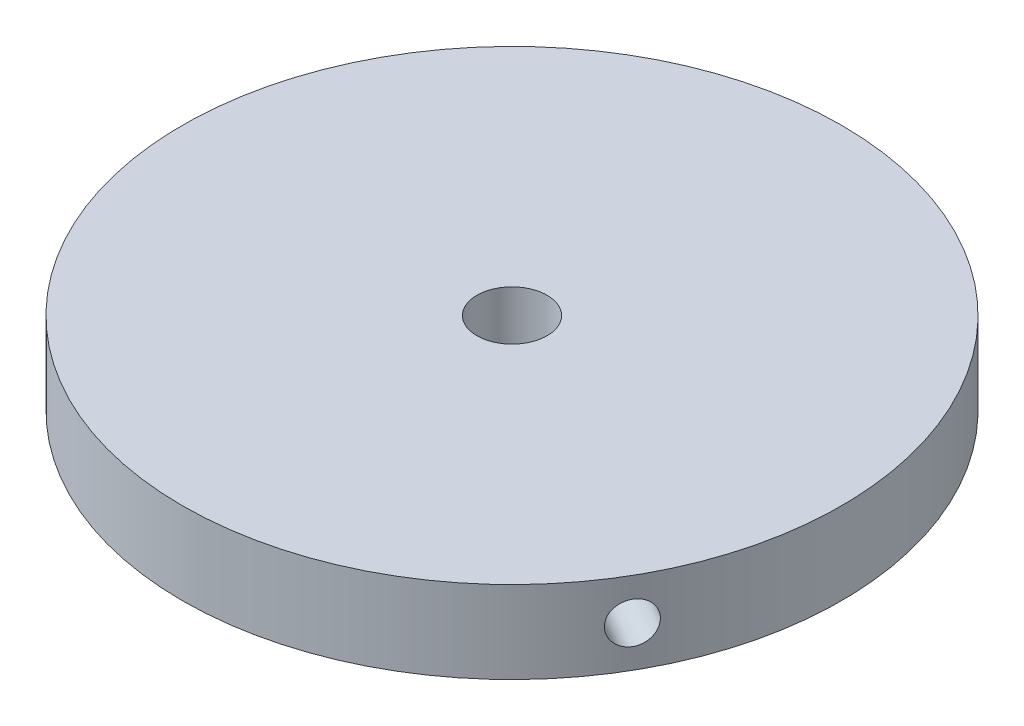
ISO-10303-21;
HEADER;
FILE_DESCRIPTION(('STEP AP214'),'2;1');
FILE_NAME('part.step','',(''),(''),'','','');
FILE_SCHEMA(('AUTOMOTIVE_DESIGN { 1 0 10303 214 1 1 1 1 }'));
ENDSEC;
DATA;
#1=APPLICATION_CONTEXT('core data for automotive mechanical design processes');
#2=APPLICATION_PROTOCOL_DEFINITION('international standard','automotive_design',2000,#1);
#3=PRODUCT_CONTEXT('',#1,'mechanical');
#4=PRODUCT('Part','Part','',(#3));
#5=PRODUCT_RELATED_PRODUCT_CATEGORY('part','',(#4));
#6=PRODUCT_DEFINITION_FORMATION('','',#4);
#7=PRODUCT_DEFINITION_CONTEXT('part definition',#1,'design');
#8=PRODUCT_DEFINITION('design','',#6,#7);
#9=PRODUCT_DEFINITION_SHAPE('','',#8);
#10=(LENGTH_UNIT() NAMED_UNIT(*) SI_UNIT(.MILLI.,.METRE.));
#11=(NAMED_UNIT(*) PLANE_ANGLE_UNIT() SI_UNIT($,.RADIAN.));
#12=(NAMED_UNIT(*) SI_UNIT($,.STERADIAN.) SOLID_ANGLE_UNIT());
#13=UNCERTAINTY_MEASURE_WITH_UNIT(LENGTH_MEASURE(1.E-05),#10,'distance_accuracy_value','');
#14=(GEOMETRIC_REPRESENTATION_CONTEXT(3) GLOBAL_UNCERTAINTY_ASSIGNED_CONTEXT((#13)) GLOBAL_UNIT_ASSIGNED_CONTEXT((#10,
#11,#12)) REPRESENTATION_CONTEXT('',''));
#15=CARTESIAN_POINT('',(0.,0.,0.));
#16=DIRECTION('',(0.,0.,1.));
#17=DIRECTION('',(1.,0.,0.));
#18=AXIS2_PLACEMENT_3D('',#15,#16,#17);
#19=CARTESIAN_POINT('',(0.,9.525,0.));
#20=DIRECTION('',(0.,-1.,0.));
#21=DIRECTION('',(0.,0.,-1.));
#22=AXIS2_PLACEMENT_3D('',#19,#20,#21);
#23=CYLINDRICAL_SURFACE('',#22,38.1508);
#24=CARTESIAN_POINT('',(-2.37489999999947,4.7625,-38.0768090920182));
#25=CARTESIAN_POINT('',(-2.37489413586988,4.62923955778668,-38.0768100819438));
#26=CARTESIAN_POINT('',(-2.3636460392407,4.49588577984348,-38.0775161883294));
#27=CARTESIAN_POINT('',(-2.31893657361351,4.232860377529,-38.0802646535466));
#28=CARTESIAN_POINT('',(-2.28544934224252,4.10319322370958,-38.0823085681043));
#29=CARTESIAN_POINT('',(-2.19722713386213,3.85138910460707,-38.0875002420933));
#30=CARTESIAN_POINT('',(-2.14250336402618,3.72924820681886,-38.0906474192143));
#31=CARTESIAN_POINT('',(-2.0133795940541,3.49591769520562,-38.0976902671423));
#32=CARTESIAN_POINT('',(-1.93898410247743,3.38472558003412,-38.1015857663855));
#33=CARTESIAN_POINT('',(-1.77250693563962,3.176251083003,-38.1096929054201));
#34=CARTESIAN_POINT('',(-1.68040211679666,3.0789871968151,-38.1139049544608));
#35=CARTESIAN_POINT('',(-1.48116851449491,2.90128838746387,-38.1221667814194));
#36=CARTESIAN_POINT('',(-1.37403910499128,2.8208541659074,-38.1262165525666));
#37=CARTESIAN_POINT('',(-1.14769361589969,2.67904159506788,-38.1337010098159));
#38=CARTESIAN_POINT('',(-1.02846798471381,2.61767846278846,-38.1371352038233));
#39=CARTESIAN_POINT('',(-0.781381432869679,2.5158473968257,-38.1429972531246));
#40=CARTESIAN_POINT('',(-0.653520604057076,2.47537924093886,-38.1454251191201));
#41=CARTESIAN_POINT('',(-0.392970572386161,2.41653795295291,-38.14899812944));
#42=CARTESIAN_POINT('',(-0.260287906823042,2.39813597689565,-38.1501449481596));
#43=CARTESIAN_POINT('',(0.00628768139456512,2.38386034131269,-38.1510322802792));
#44=CARTESIAN_POINT('',(0.140180590481936,2.38798642955395,-38.1507728094246));
#45=CARTESIAN_POINT('',(0.40518056389998,2.41862599791999,-38.1488781975727));
#46=CARTESIAN_POINT('',(0.536291231372274,2.44510844890602,-38.1472449632788));
#47=CARTESIAN_POINT('',(0.792202661450943,2.51966085334001,-38.1427888978946));
#48=CARTESIAN_POINT('',(0.917003386990177,2.567730933586,-38.1399660598169));
#49=CARTESIAN_POINT('',(1.15685190218015,2.68412920345676,-38.1334453417321));
#50=CARTESIAN_POINT('',(1.27189284970607,2.75247145647459,-38.1297468546225));
#51=CARTESIAN_POINT('',(1.48888149212011,2.90746385150151,-38.1218910792771));
#52=CARTESIAN_POINT('',(1.59082904086178,2.99411419783409,-38.117733785921));
#53=CARTESIAN_POINT('',(1.77891807211025,3.18343834404288,-38.1094199524432));
#54=CARTESIAN_POINT('',(1.86503244858678,3.28613907600321,-38.1052634255623));
#55=CARTESIAN_POINT('',(2.01880167507915,3.50455433185018,-38.0974267833623));
#56=CARTESIAN_POINT('',(2.0864565178113,3.62026886087174,-38.0937466682312));
#57=CARTESIAN_POINT('',(2.20138426186296,3.86144420670882,-38.0872784233891));
#58=CARTESIAN_POINT('',(2.2486560241653,3.98690556772019,-38.0844903435277));
#59=CARTESIAN_POINT('',(2.32145703284981,4.24400529851785,-38.0801223662641));
#60=CARTESIAN_POINT('',(2.34698653295725,4.37564359620235,-38.078542454763));
#61=CARTESIAN_POINT('',(2.37554456262128,4.64112403462579,-38.0767716250642));
#62=CARTESIAN_POINT('',(2.37861076964001,4.77496210752388,-38.076578381034));
#63=CARTESIAN_POINT('',(2.36225361437069,5.04125075694188,-38.0775966028876));
#64=CARTESIAN_POINT('',(2.34283036815736,5.17370134061948,-38.0788080615213));
#65=CARTESIAN_POINT('',(2.28207695841431,5.43334869114237,-38.0824970401971));
#66=CARTESIAN_POINT('',(2.24076414495978,5.56054953308105,-38.0849735574747));
#67=CARTESIAN_POINT('',(2.13742189487269,5.80621240610458,-38.0909127162222));
#68=CARTESIAN_POINT('',(2.07539227186152,5.92467435855839,-38.0943753665638));
#69=CARTESIAN_POINT('',(1.93228090698796,6.14966982436562,-38.1019022210508));
#70=CARTESIAN_POINT('',(1.85117391791104,6.25618725192498,-38.1059672196904));
#71=CARTESIAN_POINT('',(1.67224690008343,6.45410799017376,-38.114237898853));
#72=CARTESIAN_POINT('',(1.57442670893768,6.54551115398734,-38.1184435807428));
#73=CARTESIAN_POINT('',(1.36468789444997,6.71073601297687,-38.1265285018216));
#74=CARTESIAN_POINT('',(1.25275004490358,6.784533327553,-38.1304072835698));
#75=CARTESIAN_POINT('',(1.01805012157128,6.91228481852507,-38.1373947640191));
#76=CARTESIAN_POINT('',(0.895288114121894,6.9662391165197,-38.1405034674392));
#77=CARTESIAN_POINT('',(0.642514294357509,7.05273059877783,-38.1455983227291));
#78=CARTESIAN_POINT('',(0.512507780119615,7.08528321727929,-38.1475852834189));
#79=CARTESIAN_POINT('',(0.248861678355636,7.12809780261563,-38.1502159896755));
#80=CARTESIAN_POINT('',(0.11522212624859,7.13835998668448,-38.1508597483325));
#81=CARTESIAN_POINT('',(-0.151655169187097,7.13630028784523,-38.1507315538222));
#82=CARTESIAN_POINT('',(-0.284893209839764,7.12401656293667,-38.1499619926377));
#83=CARTESIAN_POINT('',(-0.547411038605765,7.077292844921,-38.147098450074));
#84=CARTESIAN_POINT('',(-0.676690819747182,7.04285281279105,-38.1450044663621));
#85=CARTESIAN_POINT('',(-0.927628163273493,6.95280269179797,-38.1397274474392));
#86=CARTESIAN_POINT('',(-1.04928577692349,6.89719274533709,-38.1365444195538));
#87=CARTESIAN_POINT('',(-1.28154243610964,6.76638670676156,-38.1294467063049));
#88=CARTESIAN_POINT('',(-1.39214176954909,6.69119112474452,-38.1255320399973));
#89=CARTESIAN_POINT('',(-1.59933578468099,6.52320748874398,-38.1174035323818));
#90=CARTESIAN_POINT('',(-1.69590811058063,6.4303918839951,-38.1131892291022));
#91=CARTESIAN_POINT('',(-1.87213418981856,6.22983923703435,-38.1049400887678));
#92=CARTESIAN_POINT('',(-1.95178379632911,6.12209854816575,-38.1009052958922));
#93=CARTESIAN_POINT('',(-2.09196199764921,5.89463178225065,-38.0934664290719));
#94=CARTESIAN_POINT('',(-2.15246685818654,5.77489106858609,-38.090063140164));
#95=CARTESIAN_POINT('',(-2.25243945975448,5.52701648102729,-38.0842826921491));
#96=CARTESIAN_POINT('',(-2.29193184490374,5.39889263816541,-38.0819043315978));
#97=CARTESIAN_POINT('',(-2.33849192023782,5.18540389169755,-38.0790664594053));
#98=CARTESIAN_POINT('',(-2.35212729985988,5.10141904615949,-38.0782237283132));
#99=CARTESIAN_POINT('',(-2.37033320377627,4.93246879176428,-38.0770947292796));
#100=CARTESIAN_POINT('',(-2.37490374057584,4.84750338426001,-38.0768084605703));
#101=CARTESIAN_POINT('',(-2.37489999999947,4.7625,-38.0768090920182));
#102=B_SPLINE_CURVE_WITH_KNOTS('',3,(#24,#25,#26,#27,#28,#29,#30,#31,#32,#33,#34,#35,#36,#37,
#38,#39,#40,#41,#42,#43,#44,#45,#46,#47,#48,#49,#50,#51,#52,#53,#54,#55,#56,#57,#58,#59,#60,#61,
#62,#63,#64,#65,#66,#67,#68,#69,#70,#71,#72,#73,#74,#75,#76,#77,#78,#79,#80,#81,#82,#83,#84,#85,
#86,#87,#88,#89,#90,#91,#92,#93,#94,#95,#96,#97,#98,#99,#100,#101),.UNSPECIFIED.,.T.,.F.,(4,2,2,
2,2,2,2,2,2,2,2,2,2,2,2,2,2,2,2,2,2,2,2,2,2,2,2,2,2,2,2,2,2,2,2,2,2,2,4),(0.,0.399471011661398,
0.799407392231101,1.19913300048188,1.59876707495754,1.99892700861405,2.39910362109611,
2.7995987233652,3.20008956656062,3.60005633273725,4.00001862073843,4.39942669872803,
4.79883712272907,5.19852527991674,5.59821789797274,5.99858853572004,6.39895933144387,
6.79935249719801,7.19974099042739,7.59945776186392,7.99917247025311,8.39857083028703,
8.79797278360191,9.19790631413617,9.59784373087501,9.99833180773223,10.3988174303438,
10.7990139172115,11.199206503901,11.5987224059799,11.9982390117092,12.3977529300847,
12.7972564443702,13.1973898477847,13.5976211890897,13.9983467816923,14.3986013483959,
14.6534139108114,14.9082261217046),.UNSPECIFIED.);
#103=CARTESIAN_POINT('',(-2.37489999999947,4.7625,-38.0768090920182));
#104=VERTEX_POINT('',#103);
#105=EDGE_CURVE('E64',#104,#104,#102,.T.);
#106=ORIENTED_EDGE('',*,*,#105,.T.);
#107=EDGE_LOOP('',(#106));
#108=FACE_BOUND('',#107,.T.);
#109=CARTESIAN_POINT('',(34.1629339687377,4.7625,16.9816808145621));
#110=CARTESIAN_POINT('',(34.1629318939736,4.62923955778668,16.9816863880101));
#111=CARTESIAN_POINT('',(34.1579193517268,4.49588577984348,16.9917805786279));
#112=CARTESIAN_POINT('',(34.1379448596126,4.232860377529,17.0318743442593));
#113=CARTESIAN_POINT('',(34.1229713258573,4.10319322370958,17.0618970946079));
#114=CARTESIAN_POINT('',(34.0833563432297,3.85138910460707,17.1408956052377));
#115=CARTESIAN_POINT('',(34.0587199936488,3.72924820681886,17.189861368667));
#116=CARTESIAN_POINT('',(34.0002573938834,3.49591769520562,17.3052072576593));
#117=CARTESIAN_POINT('',(33.9664332494,3.38472558003412,17.3715833929133));
#118=CARTESIAN_POINT('',(33.8902156543372,3.176251083003,17.5198104180622));
#119=CARTESIAN_POINT('',(33.8478109863869,3.0789871968151,17.6016815555115));
#120=CARTESIAN_POINT('',(33.7553491372638,2.90128838746387,17.7783538298716));
#121=CARTESIAN_POINT('',(33.705291637205,2.8208541659074,17.8731555055678));
#122=CARTESIAN_POINT('',(33.5986006227706,2.67904159506788,18.0729186777778));
#123=CARTESIAN_POINT('',(33.5419619064296,2.61767846278846,18.1778882001707));
#124=CARTESIAN_POINT('',(33.4234953141207,2.5158473968257,18.3948024556518));
#125=CARTESIAN_POINT('',(33.3616674933435,2.47537924093885,18.5067471145502));
#126=CARTESIAN_POINT('',(33.2344867952131,2.41653795295291,18.734176566094));
#127=CARTESIAN_POINT('',(33.1691386365762,2.39813597689565,18.8496565344733));
#128=CARTESIAN_POINT('',(33.0366192946246,2.38386034131269,19.0809614319583));
#129=CARTESIAN_POINT('',(32.9694481317292,2.38798642955395,19.1967863571873));
#130=CARTESIAN_POINT('',(32.8353073630262,2.41862599791998,19.4253357602436));
#131=CARTESIAN_POINT('',(32.7683376069012,2.44510844890602,19.5380643118348));
#132=CARTESIAN_POINT('',(32.6365228260382,2.51966085334001,19.7574620787096));
#133=CARTESIAN_POINT('',(32.5716778137826,2.567730933586,19.8641312583985));
#134=CARTESIAN_POINT('',(32.4461064486752,2.68412920345676,20.0685858065706));
#135=CARTESIAN_POINT('',(32.3853829911198,2.7524714564746,20.1663649460487));
#136=CARTESIAN_POINT('',(32.2700853688972,2.90746385150152,20.3503547350392));
#137=CARTESIAN_POINT('',(32.215511272869,2.99411419783409,20.436565255425));
#138=CARTESIAN_POINT('',(32.1142667662502,3.18343834404288,20.5952982179205));
#139=CARTESIAN_POINT('',(32.0676099201415,3.28613907600321,20.6677971921397));
#140=CARTESIAN_POINT('',(31.9839385756697,3.50455433185018,20.7970469275024));
#141=CARTESIAN_POINT('',(31.9469240811113,3.62026886087174,20.8537976824319));
#142=CARTESIAN_POINT('',(31.8838585447343,3.86144420670882,20.9500939059593));
#143=CARTESIAN_POINT('',(31.8578081155954,3.9869055677202,20.9896384130641));
#144=CARTESIAN_POINT('',(31.8176248319797,4.24400529851786,21.0505019473742));
#145=CARTESIAN_POINT('',(31.8034918384303,4.37564359620235,21.0718211872626));
#146=CARTESIAN_POINT('',(31.7876792400934,4.64112403462579,21.0956677515843));
#147=CARTESIAN_POINT('',(31.7859787823447,4.77496210752388,21.0982265427407));
#148=CARTESIAN_POINT('',(31.7950391659712,5.04125075694188,21.0845699416706));
#149=CARTESIAN_POINT('',(31.8057999430303,5.17370134061948,21.0683546463427));
#150=CARTESIAN_POINT('',(31.8393713971491,5.43334869114237,21.0175851394766));
#151=CARTESIAN_POINT('',(31.8621725307517,5.56054953308105,20.983045452162));
#152=CARTESIAN_POINT('',(31.9189871181477,5.80621240610458,20.8965180176761));
#153=CARTESIAN_POINT('',(31.9530006728135,5.92467435855839,20.844530113532));
#154=CARTESIAN_POINT('',(32.0310748024467,6.14966982436562,20.7243554632248));
#155=CARTESIAN_POINT('',(32.0751486890733,6.25618725192498,20.6561472495795));
#156=CARTESIAN_POINT('',(32.1717748162486,6.45410799017376,20.5053272462987));
#157=CARTESIAN_POINT('',(32.2243271391782,6.54551115398734,20.4227153167083));
#158=CARTESIAN_POINT('',(32.3361982934638,6.71073601297687,20.2451186357417));
#159=CARTESIAN_POINT('',(32.3955263417667,6.784533327553,20.1501170052636));
#160=CARTESIAN_POINT('',(32.5189276390104,6.91228481852506,19.9503546496163));
#161=CARTESIAN_POINT('',(32.5830008588698,6.9662391165197,19.8455939842556));
#162=CARTESIAN_POINT('',(32.7138000428616,7.05273059877783,19.6292328625729));
#163=CARTESIAN_POINT('',(32.7805240584143,7.08528321727929,19.5176373989304));
#164=CARTESIAN_POINT('',(32.9146253677443,7.12809780261563,19.2906285303223));
#165=CARTESIAN_POINT('',(32.9820026551487,7.13835998668448,19.1752151625757));
#166=CARTESIAN_POINT('',(33.115330283164,7.13630028784523,18.94402854778));
#167=CARTESIAN_POINT('',(33.1812828439548,7.12401656293667,18.8282562392321));
#168=CARTESIAN_POINT('',(33.3100618577329,7.077292844921,18.5994773592925));
#169=CARTESIAN_POINT('',(33.372888305214,7.04285281279105,18.4864707927724));
#170=CARTESIAN_POINT('',(33.4937869445336,6.95280269179797,18.266514169059));
#171=CARTESIAN_POINT('',(33.5518591683489,6.89719274533708,18.1595640711316));
#172=CARTESIAN_POINT('',(33.6618406979597,6.76638670676156,17.9548750474539));
#173=CARTESIAN_POINT('',(33.7137501642097,6.69119112474452,17.8571358818999));
#174=CARTESIAN_POINT('',(33.8103076776858,6.52320748874398,17.6736363474758));
#175=CARTESIAN_POINT('',(33.8549441469362,6.43039188399509,17.5878951083044));
#176=CARTESIAN_POINT('',(33.9359132214662,6.22983923703435,17.4311542767078));
#177=CARTESIAN_POINT('',(33.9722437915921,6.12209854816575,17.3601582976304));
#178=CARTESIAN_POINT('',(34.0358906446105,5.89463178225065,17.2350409808202));
#179=CARTESIAN_POINT('',(34.0631957402285,5.77489106858609,17.1809405900885));
#180=CARTESIAN_POINT('',(34.1081760261863,5.52701648102729,17.0914715534408));
#181=CARTESIAN_POINT('',(34.1258624981041,5.39889263816541,17.0560809643699));
#182=CARTESIAN_POINT('',(34.1466848663598,5.18540389169755,17.0143398202322));
#183=CARTESIAN_POINT('',(34.1527727296365,5.10141904615949,17.0021098695432));
#184=CARTESIAN_POINT('',(34.1608979397507,4.93246879176428,16.9857785947359));
#185=CARTESIAN_POINT('',(34.162935292176,4.84750338426001,16.981677259404));
#186=CARTESIAN_POINT('',(34.1629339687377,4.7625,16.9816808145621));
#187=B_SPLINE_CURVE_WITH_KNOTS('',3,(#109,#110,#111,#112,#113,#114,#115,#116,#117,#118,#119,
#120,#121,#122,#123,#124,#125,#126,#127,#128,#129,#130,#131,#132,#133,#134,#135,#136,#137,#138,
#139,#140,#141,#142,#143,#144,#145,#146,#147,#148,#149,#150,#151,#152,#153,#154,#155,#156,#157,
#158,#159,#160,#161,#162,#163,#164,#165,#166,#167,#168,#169,#170,#171,#172,#173,#174,#175,#176,
#177,#178,#179,#180,#181,#182,#183,#184,#185,#186),.UNSPECIFIED.,.T.,.F.,(4,2,2,2,2,2,2,2,2,2,2,
2,2,2,2,2,2,2,2,2,2,2,2,2,2,2,2,2,2,2,2,2,2,2,2,2,2,2,4),(0.,0.399471011661399,
0.799407392231101,1.19913300048188,1.59876707495754,1.99892700861405,2.39910362109612,
2.7995987233652,3.20008956656062,3.60005633273725,4.00001862073843,4.39942669872802,
4.79883712272907,5.19852527991674,5.59821789797275,5.99858853572004,6.39895933144387,
6.79935249719801,7.19974099042739,7.59945776186392,7.99917247025311,8.39857083028703,
8.79797278360191,9.19790631413617,9.59784373087501,9.99833180773223,10.3988174303438,
10.7990139172115,11.199206503901,11.5987224059799,11.9982390117092,12.3977529300848,
12.7972564443702,13.1973898477847,13.5976211890897,13.9983467816923,14.3986013483959,
14.6534139108114,14.9082261217046),.UNSPECIFIED.);
#188=CARTESIAN_POINT('',(34.1629339687377,4.7625,16.9816808145621));
#189=VERTEX_POINT('',#188);
#190=EDGE_CURVE('E65',#189,#189,#187,.T.);
#191=ORIENTED_EDGE('',*,*,#190,.T.);
#192=EDGE_LOOP('',(#191));
#193=FACE_BOUND('',#192,.T.);
#194=CARTESIAN_POINT('',(-31.7880339687382,4.7625,21.0951282774565));
#195=CARTESIAN_POINT('',(-31.7880377581037,4.62923955778668,21.0951236939341));
#196=CARTESIAN_POINT('',(-31.794273312486,4.49588577984348,21.0857356097018));
#197=CARTESIAN_POINT('',(-31.8190082859991,4.232860377529,21.0483903092876));
#198=CARTESIAN_POINT('',(-31.8375219836148,4.10319322370958,21.0204114734968));
#199=CARTESIAN_POINT('',(-31.8861292093675,3.85138910460707,20.9466046368559));
#200=CARTESIAN_POINT('',(-31.9162166296226,3.72924820681886,20.9007860505476));
#201=CARTESIAN_POINT('',(-31.9868777998293,3.49591769520562,20.7924830094834));
#202=CARTESIAN_POINT('',(-32.0274491469226,3.38472558003412,20.7300023734725));
#203=CARTESIAN_POINT('',(-32.1177087186975,3.176251083003,20.5898824873582));
#204=CARTESIAN_POINT('',(-32.1674088695902,3.07898719681511,20.5122233989496));
#205=CARTESIAN_POINT('',(-32.2741806227689,2.90128838746387,20.3438129515481));
#206=CARTESIAN_POINT('',(-32.3312525322137,2.8208541659074,20.2530610469991));
#207=CARTESIAN_POINT('',(-32.4509070068709,2.67904159506788,20.0607823320384));
#208=CARTESIAN_POINT('',(-32.5134939217158,2.61767846278846,19.9592470036529));
#209=CARTESIAN_POINT('',(-32.642113881251,2.5158473968257,19.7481947974731));
#210=CARTESIAN_POINT('',(-32.7081468892864,2.47537924093886,19.6386780045702));
#211=CARTESIAN_POINT('',(-32.8415162228269,2.41653795295291,19.4148215633463));
#212=CARTESIAN_POINT('',(-32.9088507297532,2.39813597689565,19.3004884136866));
#213=CARTESIAN_POINT('',(-33.0429069760191,2.38386034131269,19.0700708483212));
#214=CARTESIAN_POINT('',(-33.1096287222112,2.38798642955395,18.9539864522376));
#215=CARTESIAN_POINT('',(-33.2404879269262,2.41862599791998,18.7235424373294));
#216=CARTESIAN_POINT('',(-33.3046288382735,2.44510844890602,18.6091806514443));
#217=CARTESIAN_POINT('',(-33.4287254874891,2.51966085334001,18.3853268191853));
#218=CARTESIAN_POINT('',(-33.4886812007728,2.567730933586,18.2758348014188));
#219=CARTESIAN_POINT('',(-33.6029583508554,2.68412920345676,18.0648595351619));
#220=CARTESIAN_POINT('',(-33.6572758408259,2.75247145647459,17.9633819085742));
#221=CARTESIAN_POINT('',(-33.7589668610173,2.90746385150151,17.7715363442382));
#222=CARTESIAN_POINT('',(-33.8063403137308,2.9941141978341,17.6811685304963));
#223=CARTESIAN_POINT('',(-33.8931848383604,3.18343834404288,17.5141217345231));
#224=CARTESIAN_POINT('',(-33.9326423687283,3.28613907600321,17.4374662334229));
#225=CARTESIAN_POINT('',(-34.0027402507489,3.50455433185018,17.3003798558602));
#226=CARTESIAN_POINT('',(-34.0333805989226,3.62026886087174,17.2399489857995));
#227=CARTESIAN_POINT('',(-34.0852428065973,3.86144420670882,17.1371845174301));
#228=CARTESIAN_POINT('',(-34.1064641397607,3.98690556772019,17.0948519304639));
#229=CARTESIAN_POINT('',(-34.1390818648296,4.24400529851786,17.0296204188902));
#230=CARTESIAN_POINT('',(-34.1504783713875,4.37564359620235,17.0067212675007));
#231=CARTESIAN_POINT('',(-34.1632238027147,4.64112403462579,16.9811038734803));
#232=CARTESIAN_POINT('',(-34.1645895519847,4.77496210752388,16.9783518382937));
#233=CARTESIAN_POINT('',(-34.157292780342,5.04125075694188,16.9930266612173));
#234=CARTESIAN_POINT('',(-34.1486303111877,5.17370134061948,17.0104534151789));
#235=CARTESIAN_POINT('',(-34.1214483555635,5.43334869114237,17.0649119007208));
#236=CARTESIAN_POINT('',(-34.1029366757115,5.56054953308104,17.101928105313));
#237=CARTESIAN_POINT('',(-34.0564090130204,5.80621240610458,17.1943946985464));
#238=CARTESIAN_POINT('',(-34.028392944675,5.92467435855839,17.2498452530321));
#239=CARTESIAN_POINT('',(-33.9633557094346,6.14966982436562,17.3775467578264));
#240=CARTESIAN_POINT('',(-33.9263226069844,6.25618725192498,17.4498199701112));
#241=CARTESIAN_POINT('',(-33.844021716332,6.45410799017376,17.6089106525547));
#242=CARTESIAN_POINT('',(-33.7987538481159,6.54551115398734,17.6957282640348));
#243=CARTESIAN_POINT('',(-33.7008861879138,6.71073601297687,17.8814098660802));
#244=CARTESIAN_POINT('',(-33.6482763866703,6.784533327553,17.9802902783065));
#245=CARTESIAN_POINT('',(-33.5369777605817,6.91228481852507,18.1870401144031));
#246=CARTESIAN_POINT('',(-33.4782889729917,6.9662391165197,18.294909483184));
#247=CARTESIAN_POINT('',(-33.3563143372191,7.05273059877783,18.5163654601565));
#248=CARTESIAN_POINT('',(-33.2930318385339,7.08528321727929,18.6299478844889));
#249=CARTESIAN_POINT('',(-33.1634870461,7.12809780261563,18.8595874593535));
#250=CARTESIAN_POINT('',(-33.0972247813973,7.13835998668448,18.9756445857571));
#251=CARTESIAN_POINT('',(-32.9636751139769,7.13630028784523,19.2067030060425));
#252=CARTESIAN_POINT('',(-32.8963896341151,7.12401656293667,19.3217057534059));
#253=CARTESIAN_POINT('',(-32.7626508191271,7.077292844921,19.5476210907818));
#254=CARTESIAN_POINT('',(-32.6961974854668,7.04285281279105,19.65853367359));
#255=CARTESIAN_POINT('',(-32.5661587812601,6.95280269179797,19.8732132783805));
#256=CARTESIAN_POINT('',(-32.5025733914254,6.89719274533709,19.9769803484225));
#257=CARTESIAN_POINT('',(-32.38029826185,6.76638670676156,20.1745716588513));
#258=CARTESIAN_POINT('',(-32.3216083946606,6.69119112474452,20.2683961580978));
#259=CARTESIAN_POINT('',(-32.2109718930048,6.52320748874398,20.4437671849063));
#260=CARTESIAN_POINT('',(-32.1590360363555,6.43039188399509,20.5252941207981));
#261=CARTESIAN_POINT('',(-32.0637790316476,6.22983923703435,20.6737858120603));
#262=CARTESIAN_POINT('',(-32.020459995263,6.12209854816575,20.7407469982621));
#263=CARTESIAN_POINT('',(-31.9439286469612,5.89463178225065,20.8584254482519));
#264=CARTESIAN_POINT('',(-31.9107288820419,5.77489106858609,20.9091225500758));
#265=CARTESIAN_POINT('',(-31.8557365664318,5.52701648102729,20.9928111387086));
#266=CARTESIAN_POINT('',(-31.8339306532004,5.39889263816541,21.0258233672282));
#267=CARTESIAN_POINT('',(-31.8081929461219,5.18540389169755,21.0647266391734));
#268=CARTESIAN_POINT('',(-31.8006454297766,5.10141904615949,21.0761138587703));
#269=CARTESIAN_POINT('',(-31.7905647359744,4.93246879176428,21.0913161345439));
#270=CARTESIAN_POINT('',(-31.7880315516001,4.84750338426001,21.0951312011667));
#271=CARTESIAN_POINT('',(-31.7880339687382,4.7625,21.0951282774565));
#272=B_SPLINE_CURVE_WITH_KNOTS('',3,(#194,#195,#196,#197,#198,#199,#200,#201,#202,#203,#204,
#205,#206,#207,#208,#209,#210,#211,#212,#213,#214,#215,#216,#217,#218,#219,#220,#221,#222,#223,
#224,#225,#226,#227,#228,#229,#230,#231,#232,#233,#234,#235,#236,#237,#238,#239,#240,#241,#242,
#243,#244,#245,#246,#247,#248,#249,#250,#251,#252,#253,#254,#255,#256,#257,#258,#259,#260,#261,
#262,#263,#264,#265,#266,#267,#268,#269,#270,#271),.UNSPECIFIED.,.T.,.F.,(4,2,2,2,2,2,2,2,2,2,2,
2,2,2,2,2,2,2,2,2,2,2,2,2,2,2,2,2,2,2,2,2,2,2,2,2,2,2,4),(0.,0.399471011661399,
0.799407392231101,1.19913300048188,1.59876707495754,1.99892700861404,2.39910362109612,
2.7995987233652,3.20008956656062,3.60005633273725,4.00001862073843,4.39942669872803,
4.79883712272907,5.19852527991674,5.59821789797274,5.99858853572004,6.39895933144388,
6.79935249719801,7.19974099042739,7.59945776186392,7.99917247025312,8.39857083028703,
8.79797278360192,9.19790631413617,9.59784373087501,9.99833180773223,10.3988174303438,
10.7990139172115,11.199206503901,11.5987224059799,11.9982390117092,12.3977529300848,
12.7972564443702,13.1973898477847,13.5976211890897,13.9983467816923,14.3986013483959,
14.6534139108114,14.9082261217046),.UNSPECIFIED.);
#273=CARTESIAN_POINT('',(-31.7880339687382,4.7625,21.0951282774565));
#274=VERTEX_POINT('',#273);
#275=EDGE_CURVE('E10',#274,#274,#272,.T.);
#276=ORIENTED_EDGE('',*,*,#275,.T.);
#277=EDGE_LOOP('',(#276));
#278=FACE_BOUND('',#277,.T.);
#279=CARTESIAN_POINT('',(0.,9.525,0.));
#280=DIRECTION('',(0.,1.,0.));
#281=DIRECTION('',(0.,0.,1.));
#282=AXIS2_PLACEMENT_3D('',#279,#280,#281);
#283=CIRCLE('',#282,38.1508);
#284=CARTESIAN_POINT('',(0.,9.525,38.1508));
#285=VERTEX_POINT('',#284);
#286=EDGE_CURVE('E47',#285,#285,#283,.T.);
#287=ORIENTED_EDGE('',*,*,#286,.F.);
#288=EDGE_LOOP('',(#287));
#289=FACE_BOUND('',#288,.T.);
#290=CARTESIAN_POINT('',(0.,0.,0.));
#291=DIRECTION('',(0.,1.,0.));
#292=DIRECTION('',(0.,0.,1.));
#293=AXIS2_PLACEMENT_3D('',#290,#291,#292);
#294=CIRCLE('',#293,38.1508);
#295=CARTESIAN_POINT('',(0.,0.,38.1508));
#296=VERTEX_POINT('',#295);
#297=EDGE_CURVE('E51',#296,#296,#294,.T.);
#298=ORIENTED_EDGE('',*,*,#297,.T.);
#299=EDGE_LOOP('',(#298));
#300=FACE_BOUND('',#299,.T.);
#301=ADVANCED_FACE('F36',(#108,#193,#278,#289,#300),#23,.T.);
#302=CARTESIAN_POINT('',(0.,9.525,0.));
#303=DIRECTION('',(0.,1.,0.));
#304=DIRECTION('',(0.,0.,1.));
#305=AXIS2_PLACEMENT_3D('',#302,#303,#304);
#306=PLANE('',#305);
#307=CARTESIAN_POINT('',(0.,9.525,0.));
#308=DIRECTION('',(0.,1.,0.));
#309=DIRECTION('',(0.,0.,1.));
#310=AXIS2_PLACEMENT_3D('',#307,#308,#309);
#311=CIRCLE('',#310,4.064);
#312=CARTESIAN_POINT('',(0.,9.525,4.064));
#313=VERTEX_POINT('',#312);
#314=EDGE_CURVE('E97',#313,#313,#311,.T.);
#315=ORIENTED_EDGE('',*,*,#314,.F.);
#316=EDGE_LOOP('',(#315));
#317=FACE_BOUND('',#316,.T.);
#318=ORIENTED_EDGE('',*,*,#286,.T.);
#319=EDGE_LOOP('',(#318));
#320=FACE_BOUND('',#319,.T.);
#321=ADVANCED_FACE('F113',(#317,#320),#306,.T.);
#322=CARTESIAN_POINT('',(0.,0.,0.));
#323=DIRECTION('',(0.,1.,0.));
#324=DIRECTION('',(0.,0.,1.));
#325=AXIS2_PLACEMENT_3D('',#322,#323,#324);
#326=PLANE('',#325);
#327=CARTESIAN_POINT('',(0.,0.,0.));
#328=DIRECTION('',(0.,1.,0.));
#329=DIRECTION('',(0.,0.,1.));
#330=AXIS2_PLACEMENT_3D('',#327,#328,#329);
#331=CIRCLE('',#330,4.064);
#332=CARTESIAN_POINT('',(0.,0.,4.064));
#333=VERTEX_POINT('',#332);
#334=EDGE_CURVE('E73',#333,#333,#331,.T.);
#335=ORIENTED_EDGE('',*,*,#334,.T.);
#336=EDGE_LOOP('',(#335));
#337=FACE_BOUND('',#336,.T.);
#338=ORIENTED_EDGE('',*,*,#297,.F.);
#339=EDGE_LOOP('',(#338));
#340=FACE_BOUND('',#339,.T.);
#341=ADVANCED_FACE('F103',(#337,#340),#326,.F.);
#342=CARTESIAN_POINT('',(-27.5403006606683,4.7625,15.9003999999997));
#343=DIRECTION('',(-0.866025403784443,0.,0.499999999999992));
#344=DIRECTION('',(0.499999999999992,0.,0.866025403784443));
#345=AXIS2_PLACEMENT_3D('',#342,#343,#344);
#346=CYLINDRICAL_SURFACE('',#345,2.3749);
#347=CARTESIAN_POINT('',(-27.5403006606683,4.7625,15.9003999999997));
#348=DIRECTION('',(-0.866025403784443,0.,0.499999999999992));
#349=DIRECTION('',(0.499999999999992,0.,0.866025403784443));
#350=AXIS2_PLACEMENT_3D('',#347,#348,#349);
#351=CIRCLE('',#350,2.3749);
#352=CARTESIAN_POINT('',(-26.3528506606683,4.7625,17.9571237314474));
#353=VERTEX_POINT('',#352);
#354=EDGE_CURVE('E56',#353,#353,#351,.T.);
#355=ORIENTED_EDGE('',*,*,#354,.F.);
#356=EDGE_LOOP('',(#355));
#357=FACE_BOUND('',#356,.T.);
#358=ORIENTED_EDGE('',*,*,#275,.F.);
#359=EDGE_LOOP('',(#358));
#360=FACE_BOUND('',#359,.T.);
#361=ADVANCED_FACE('F120',(#357,#360),#346,.F.);
#362=CARTESIAN_POINT('',(-27.5403006606683,4.7625,15.9003999999997));
#363=DIRECTION('',(-0.866025403784443,0.,0.499999999999992));
#364=DIRECTION('',(0.499999999999992,0.,0.866025403784443));
#365=AXIS2_PLACEMENT_3D('',#362,#363,#364);
#366=PLANE('',#365);
#367=ORIENTED_EDGE('',*,*,#354,.T.);
#368=EDGE_LOOP('',(#367));
#369=FACE_BOUND('',#368,.T.);
#370=ADVANCED_FACE('F82',(#369),#366,.T.);
#371=CARTESIAN_POINT('',(27.5403006606679,4.7625,15.9004000000005));
#372=DIRECTION('',(0.866025403784429,0.,0.500000000000016));
#373=DIRECTION('',(0.500000000000016,0.,-0.866025403784429));
#374=AXIS2_PLACEMENT_3D('',#371,#372,#373);
#375=CYLINDRICAL_SURFACE('',#374,2.3749);
#376=CARTESIAN_POINT('',(27.5403006606679,4.7625,15.9004000000005));
#377=DIRECTION('',(0.866025403784429,0.,0.500000000000016));
#378=DIRECTION('',(0.500000000000016,0.,-0.866025403784429));
#379=AXIS2_PLACEMENT_3D('',#376,#377,#378);
#380=CIRCLE('',#379,2.3749);
#381=CARTESIAN_POINT('',(28.7277506606679,4.7625,13.8436762685529));
#382=VERTEX_POINT('',#381);
#383=EDGE_CURVE('E61',#382,#382,#380,.T.);
#384=ORIENTED_EDGE('',*,*,#383,.F.);
#385=EDGE_LOOP('',(#384));
#386=FACE_BOUND('',#385,.T.);
#387=ORIENTED_EDGE('',*,*,#190,.F.);
#388=EDGE_LOOP('',(#387));
#389=FACE_BOUND('',#388,.T.);
#390=ADVANCED_FACE('F77',(#386,#389),#375,.F.);
#391=CARTESIAN_POINT('',(27.5403006606679,4.7625,15.9004000000005));
#392=DIRECTION('',(0.866025403784429,0.,0.500000000000016));
#393=DIRECTION('',(0.500000000000016,0.,-0.866025403784429));
#394=AXIS2_PLACEMENT_3D('',#391,#392,#393);
#395=PLANE('',#394);
#396=ORIENTED_EDGE('',*,*,#383,.T.);
#397=EDGE_LOOP('',(#396));
#398=FACE_BOUND('',#397,.T.);
#399=ADVANCED_FACE('F81',(#398),#395,.T.);
#400=CARTESIAN_POINT('',(4.42354486374086E-13,4.7625,-31.8008));
#401=DIRECTION('',(0.,0.,-1.));
#402=DIRECTION('',(-1.,0.,0.));
#403=AXIS2_PLACEMENT_3D('',#400,#401,#402);
#404=CYLINDRICAL_SURFACE('',#403,2.3749);
#405=CARTESIAN_POINT('',(4.42354486374086E-13,4.7625,-31.8008));
#406=DIRECTION('',(0.,0.,-1.));
#407=DIRECTION('',(-1.,0.,0.));
#408=AXIS2_PLACEMENT_3D('',#405,#406,#407);
#409=CIRCLE('',#408,2.3749);
#410=CARTESIAN_POINT('',(-2.37489999999956,4.7625,-31.8008));
#411=VERTEX_POINT('',#410);
#412=EDGE_CURVE('E60',#411,#411,#409,.T.);
#413=ORIENTED_EDGE('',*,*,#412,.F.);
#414=EDGE_LOOP('',(#413));
#415=FACE_BOUND('',#414,.T.);
#416=ORIENTED_EDGE('',*,*,#105,.F.);
#417=EDGE_LOOP('',(#416));
#418=FACE_BOUND('',#417,.T.);
#419=ADVANCED_FACE('F86',(#415,#418),#404,.F.);
#420=CARTESIAN_POINT('',(4.42354486374086E-13,4.7625,-31.8008));
#421=DIRECTION('',(0.,0.,-1.));
#422=DIRECTION('',(-1.,0.,0.));
#423=AXIS2_PLACEMENT_3D('',#420,#421,#422);
#424=PLANE('',#423);
#425=ORIENTED_EDGE('',*,*,#412,.T.);
#426=EDGE_LOOP('',(#425));
#427=FACE_BOUND('',#426,.T.);
#428=ADVANCED_FACE('F109',(#427),#424,.T.);
#429=CARTESIAN_POINT('',(0.,0.,0.));
#430=DIRECTION('',(0.,1.,0.));
#431=DIRECTION('',(0.,0.,1.));
#432=AXIS2_PLACEMENT_3D('',#429,#430,#431);
#433=CYLINDRICAL_SURFACE('',#432,4.064);
#434=CARTESIAN_POINT('',(0.,0.,4.064));
#435=CARTESIAN_POINT('',(0.,0.0992187499999999,4.064));
#436=CARTESIAN_POINT('',(0.,0.1984375,4.064));
#437=CARTESIAN_POINT('',(0.,0.396875,4.064));
#438=CARTESIAN_POINT('',(0.,0.49609375,4.064));
#439=CARTESIAN_POINT('',(0.,0.69453125,4.064));
#440=CARTESIAN_POINT('',(0.,0.79375,4.064));
#441=CARTESIAN_POINT('',(0.,0.9921875,4.064));
#442=CARTESIAN_POINT('',(0.,1.09140625,4.064));
#443=CARTESIAN_POINT('',(0.,1.28984375,4.064));
#444=CARTESIAN_POINT('',(0.,1.3890625,4.064));
#445=CARTESIAN_POINT('',(0.,1.5875,4.064));
#446=CARTESIAN_POINT('',(0.,1.68671875,4.064));
#447=CARTESIAN_POINT('',(0.,1.88515625,4.064));
#448=CARTESIAN_POINT('',(0.,1.984375,4.064));
#449=CARTESIAN_POINT('',(0.,2.1828125,4.064));
#450=CARTESIAN_POINT('',(0.,2.28203125,4.064));
#451=CARTESIAN_POINT('',(0.,2.48046875,4.064));
#452=CARTESIAN_POINT('',(0.,2.5796875,4.064));
#453=CARTESIAN_POINT('',(0.,2.778125,4.064));
#454=CARTESIAN_POINT('',(0.,2.87734375,4.064));
#455=CARTESIAN_POINT('',(0.,3.07578125,4.064));
#456=CARTESIAN_POINT('',(0.,3.175,4.064));
#457=CARTESIAN_POINT('',(0.,3.3734375,4.064));
#458=CARTESIAN_POINT('',(0.,3.47265625,4.064));
#459=CARTESIAN_POINT('',(0.,3.67109375,4.064));
#460=CARTESIAN_POINT('',(0.,3.7703125,4.064));
#461=CARTESIAN_POINT('',(0.,3.96875,4.064));
#462=CARTESIAN_POINT('',(0.,4.06796875,4.064));
#463=CARTESIAN_POINT('',(0.,4.26640625,4.064));
#464=CARTESIAN_POINT('',(0.,4.365625,4.064));
#465=CARTESIAN_POINT('',(0.,4.5640625,4.064));
#466=CARTESIAN_POINT('',(0.,4.66328125,4.064));
#467=CARTESIAN_POINT('',(0.,4.86171875,4.064));
#468=CARTESIAN_POINT('',(0.,4.9609375,4.064));
#469=CARTESIAN_POINT('',(0.,5.159375,4.064));
#470=CARTESIAN_POINT('',(0.,5.25859375,4.064));
#471=CARTESIAN_POINT('',(0.,5.45703125,4.064));
#472=CARTESIAN_POINT('',(0.,5.55625,4.064));
#473=CARTESIAN_POINT('',(0.,5.7546875,4.064));
#474=CARTESIAN_POINT('',(0.,5.85390625,4.064));
#475=CARTESIAN_POINT('',(0.,6.05234375,4.064));
#476=CARTESIAN_POINT('',(0.,6.1515625,4.064));
#477=CARTESIAN_POINT('',(0.,6.35,4.064));
#478=CARTESIAN_POINT('',(0.,6.44921875,4.064));
#479=CARTESIAN_POINT('',(0.,6.64765625,4.064));
#480=CARTESIAN_POINT('',(0.,6.746875,4.064));
#481=CARTESIAN_POINT('',(0.,6.9453125,4.064));
#482=CARTESIAN_POINT('',(0.,7.04453125,4.064));
#483=CARTESIAN_POINT('',(0.,7.24296875,4.064));
#484=CARTESIAN_POINT('',(0.,7.3421875,4.064));
#485=CARTESIAN_POINT('',(0.,7.540625,4.064));
#486=CARTESIAN_POINT('',(0.,7.63984375,4.064));
#487=CARTESIAN_POINT('',(0.,7.83828125,4.064));
#488=CARTESIAN_POINT('',(0.,7.9375,4.064));
#489=CARTESIAN_POINT('',(0.,8.1359375,4.064));
#490=CARTESIAN_POINT('',(0.,8.23515625,4.064));
#491=CARTESIAN_POINT('',(0.,8.43359375,4.064));
#492=CARTESIAN_POINT('',(0.,8.5328125,4.064));
#493=CARTESIAN_POINT('',(0.,8.73125,4.064));
#494=CARTESIAN_POINT('',(0.,8.83046875,4.064));
#495=CARTESIAN_POINT('',(0.,9.02890625,4.064));
#496=CARTESIAN_POINT('',(0.,9.128125,4.064));
#497=CARTESIAN_POINT('',(0.,9.3265625,4.064));
#498=CARTESIAN_POINT('',(0.,9.42578125,4.064));
#499=CARTESIAN_POINT('',(0.,9.525,4.064));
#500=B_SPLINE_CURVE_WITH_KNOTS('',3,(#434,#435,#436,#437,#438,#439,#440,#441,#442,#443,#444,
#445,#446,#447,#448,#449,#450,#451,#452,#453,#454,#455,#456,#457,#458,#459,#460,#461,#462,#463,
#464,#465,#466,#467,#468,#469,#470,#471,#472,#473,#474,#475,#476,#477,#478,#479,#480,#481,#482,
#483,#484,#485,#486,#487,#488,#489,#490,#491,#492,#493,#494,#495,#496,#497,#498,#499),
.UNSPECIFIED.,.F.,.F.,(4,2,2,2,2,2,2,2,2,2,2,2,2,2,2,2,2,2,2,2,2,2,2,2,2,2,2,2,2,2,2,2,4),(0.,
0.29765625,0.5953125,0.89296875,1.190625,1.48828125,1.7859375,2.08359375,2.38125,2.67890625,
2.9765625,3.27421875,3.571875,3.86953125,4.1671875,4.46484375,4.7625,5.06015625,5.3578125,
5.65546875,5.953125,6.25078125,6.5484375,6.84609375,7.14375,7.44140625,7.7390625,8.03671875,
8.334375,8.63203125,8.9296875,9.22734375,9.525),.UNSPECIFIED.);
#501=EDGE_CURVE('BSEAM106',#333,#313,#500,.T.);
#502=ORIENTED_EDGE('',*,*,#334,.F.);
#503=ORIENTED_EDGE('',*,*,#314,.T.);
#504=ORIENTED_EDGE('',*,*,#501,.T.);
#505=ORIENTED_EDGE('',*,*,#501,.F.);
#506=EDGE_LOOP('',(#502,#504,#503,#505));
#507=FACE_BOUND('',#506,.T.);
#508=ADVANCED_FACE('F106',(#507),#433,.F.);
#509=CLOSED_SHELL('',(#301,#321,#341,#361,#370,#390,#399,#419,#428,#508));
#510=MANIFOLD_SOLID_BREP('B2',#509);
#511=ADVANCED_BREP_SHAPE_REPRESENTATION('',(#18,#510),#14);
#512=SHAPE_DEFINITION_REPRESENTATION(#9,#511);
ENDSEC;
END-ISO-10303-21;
